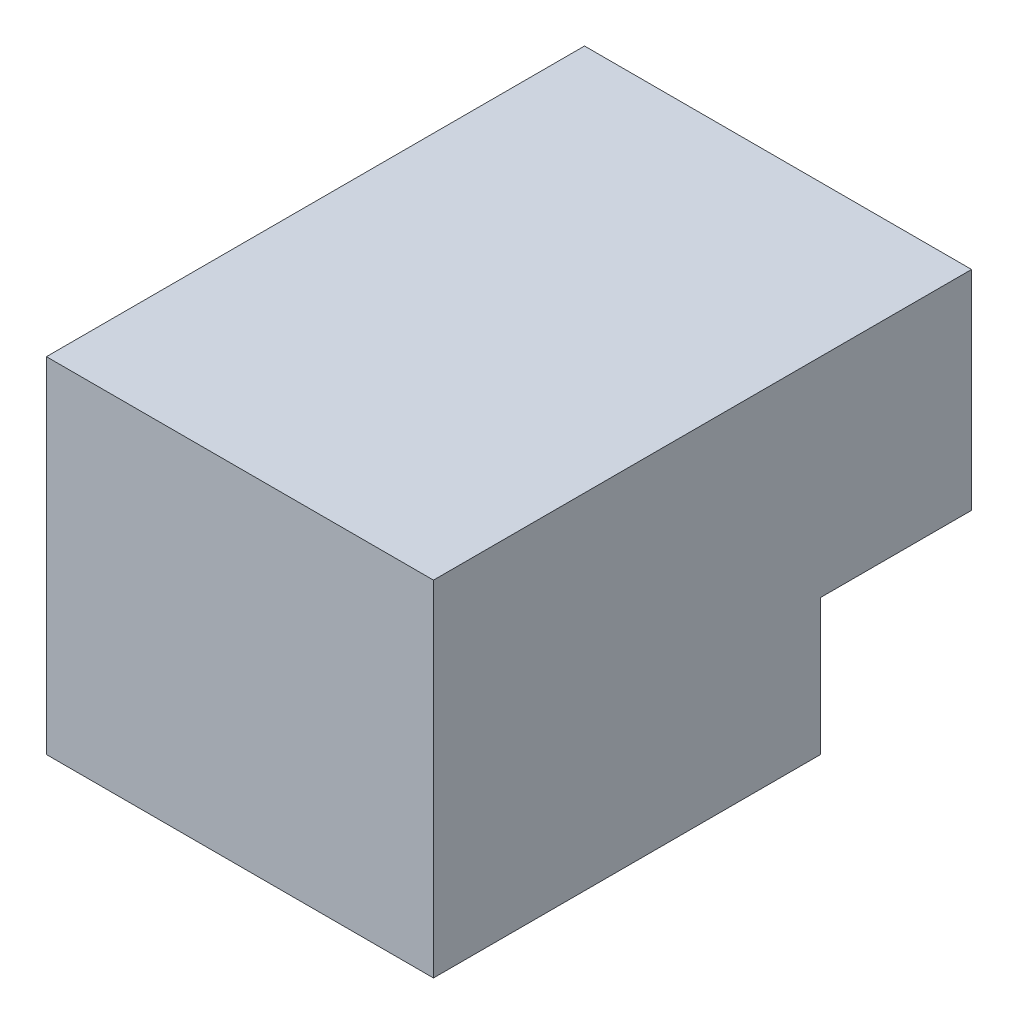
ISO-10303-21;
HEADER;
FILE_DESCRIPTION(('STEP AP214'),'2;1');
FILE_NAME('part.step','',(''),(''),'','','');
FILE_SCHEMA(('AUTOMOTIVE_DESIGN { 1 0 10303 214 1 1 1 1 }'));
ENDSEC;
DATA;
#1=APPLICATION_CONTEXT('core data for automotive mechanical design processes');
#2=APPLICATION_PROTOCOL_DEFINITION('international standard','automotive_design',2000,#1);
#3=PRODUCT_CONTEXT('',#1,'mechanical');
#4=PRODUCT('Part','Part','',(#3));
#5=PRODUCT_RELATED_PRODUCT_CATEGORY('part','',(#4));
#6=PRODUCT_DEFINITION_FORMATION('','',#4);
#7=PRODUCT_DEFINITION_CONTEXT('part definition',#1,'design');
#8=PRODUCT_DEFINITION('design','',#6,#7);
#9=PRODUCT_DEFINITION_SHAPE('','',#8);
#10=(LENGTH_UNIT() NAMED_UNIT(*) SI_UNIT(.MILLI.,.METRE.));
#11=(NAMED_UNIT(*) PLANE_ANGLE_UNIT() SI_UNIT($,.RADIAN.));
#12=(NAMED_UNIT(*) SI_UNIT($,.STERADIAN.) SOLID_ANGLE_UNIT());
#13=UNCERTAINTY_MEASURE_WITH_UNIT(LENGTH_MEASURE(1.E-05),#10,'distance_accuracy_value','');
#14=(GEOMETRIC_REPRESENTATION_CONTEXT(3) GLOBAL_UNCERTAINTY_ASSIGNED_CONTEXT((#13)) GLOBAL_UNIT_ASSIGNED_CONTEXT((#10,
#11,#12)) REPRESENTATION_CONTEXT('',''));
#15=CARTESIAN_POINT('',(0.,0.,0.));
#16=DIRECTION('',(0.,0.,1.));
#17=DIRECTION('',(1.,0.,0.));
#18=AXIS2_PLACEMENT_3D('',#15,#16,#17);
#19=CARTESIAN_POINT('',(-2.54,25.4,-62.54));
#20=DIRECTION('',(0.,0.,1.));
#21=DIRECTION('',(1.,0.,0.));
#22=AXIS2_PLACEMENT_3D('',#19,#20,#21);
#23=PLANE('',#22);
#24=DIRECTION('',(-1.,0.,0.));
#25=VECTOR('',#24,1.);
#26=CARTESIAN_POINT('',(62.54,22.86,-62.54));
#27=LINE('',#26,#25);
#28=CARTESIAN_POINT('',(62.54,22.86,-62.54));
#29=VERTEX_POINT('',#28);
#30=CARTESIAN_POINT('',(-2.54,22.86,-62.54));
#31=VERTEX_POINT('',#30);
#32=EDGE_CURVE('E152',#29,#31,#27,.T.);
#33=ORIENTED_EDGE('',*,*,#32,.F.);
#34=DIRECTION('',(0.,-1.,0.));
#35=VECTOR('',#34,1.);
#36=CARTESIAN_POINT('',(62.54,25.4,-62.54));
#37=LINE('',#36,#35);
#38=CARTESIAN_POINT('',(62.54,0.,-62.54));
#39=VERTEX_POINT('',#38);
#40=EDGE_CURVE('E48',#29,#39,#37,.T.);
#41=ORIENTED_EDGE('',*,*,#40,.T.);
#42=DIRECTION('',(-1.,0.,0.));
#43=VECTOR('',#42,1.);
#44=CARTESIAN_POINT('',(-2.54,0.,-62.54));
#45=LINE('',#44,#43);
#46=CARTESIAN_POINT('',(-2.54,0.,-62.54));
#47=VERTEX_POINT('',#46);
#48=EDGE_CURVE('E241',#39,#47,#45,.T.);
#49=ORIENTED_EDGE('',*,*,#48,.T.);
#50=DIRECTION('',(0.,-1.,0.));
#51=VECTOR('',#50,1.);
#52=CARTESIAN_POINT('',(-2.54,25.4,-62.54));
#53=LINE('',#52,#51);
#54=EDGE_CURVE('E252',#31,#47,#53,.T.);
#55=ORIENTED_EDGE('',*,*,#54,.F.);
#56=EDGE_LOOP('',(#33,#41,#49,#55));
#57=FACE_BOUND('',#56,.T.);
#58=ADVANCED_FACE('F39',(#57),#23,.F.);
#59=CARTESIAN_POINT('',(0.,25.4,0.));
#60=DIRECTION('',(0.,1.,0.));
#61=DIRECTION('',(0.,0.,1.));
#62=AXIS2_PLACEMENT_3D('',#59,#60,#61);
#63=PLANE('',#62);
#64=DIRECTION('',(0.,0.,-1.));
#65=VECTOR('',#64,1.);
#66=CARTESIAN_POINT('',(0.,25.4,75.3016519878432));
#67=LINE('',#66,#65);
#68=CARTESIAN_POINT('',(0.,25.4,-60.));
#69=VERTEX_POINT('',#68);
#70=CARTESIAN_POINT('',(0.,25.4,-87.94));
#71=VERTEX_POINT('',#70);
#72=EDGE_CURVE('E202',#69,#71,#67,.T.);
#73=ORIENTED_EDGE('',*,*,#72,.F.);
#74=DIRECTION('',(-1.,0.,0.));
#75=VECTOR('',#74,1.);
#76=CARTESIAN_POINT('',(0.,25.4,-60.));
#77=LINE('',#76,#75);
#78=CARTESIAN_POINT('',(60.,25.4,-60.));
#79=VERTEX_POINT('',#78);
#80=EDGE_CURVE('E209',#79,#69,#77,.T.);
#81=ORIENTED_EDGE('',*,*,#80,.F.);
#82=DIRECTION('',(0.,0.,-1.));
#83=VECTOR('',#82,1.);
#84=CARTESIAN_POINT('',(60.,25.4,75.3016519878432));
#85=LINE('',#84,#83);
#86=CARTESIAN_POINT('',(60.,25.4,-87.94));
#87=VERTEX_POINT('',#86);
#88=EDGE_CURVE('E63',#79,#87,#85,.T.);
#89=ORIENTED_EDGE('',*,*,#88,.T.);
#90=DIRECTION('',(1.,0.,0.));
#91=VECTOR('',#90,1.);
#92=CARTESIAN_POINT('',(62.54,25.4,-87.94));
#93=LINE('',#92,#91);
#94=EDGE_CURVE('E161',#71,#87,#93,.T.);
#95=ORIENTED_EDGE('',*,*,#94,.F.);
#96=EDGE_LOOP('',(#73,#81,#89,#95));
#97=FACE_BOUND('',#96,.T.);
#98=ADVANCED_FACE('F292',(#97),#63,.T.);
#99=CARTESIAN_POINT('',(0.,0.,0.));
#100=DIRECTION('',(0.,1.,0.));
#101=DIRECTION('',(0.,0.,1.));
#102=AXIS2_PLACEMENT_3D('',#99,#100,#101);
#103=PLANE('',#102);
#104=DIRECTION('',(1.,0.,0.));
#105=VECTOR('',#104,1.);
#106=CARTESIAN_POINT('',(-2.54,0.,2.54));
#107=LINE('',#106,#105);
#108=CARTESIAN_POINT('',(-2.54,0.,2.54));
#109=VERTEX_POINT('',#108);
#110=CARTESIAN_POINT('',(62.54,0.,2.54));
#111=VERTEX_POINT('',#110);
#112=EDGE_CURVE('E233',#109,#111,#107,.T.);
#113=ORIENTED_EDGE('',*,*,#112,.F.);
#114=DIRECTION('',(0.,0.,1.));
#115=VECTOR('',#114,1.);
#116=CARTESIAN_POINT('',(-2.54,0.,2.54));
#117=LINE('',#116,#115);
#118=EDGE_CURVE('E245',#47,#109,#117,.T.);
#119=ORIENTED_EDGE('',*,*,#118,.F.);
#120=ORIENTED_EDGE('',*,*,#48,.F.);
#121=DIRECTION('',(0.,0.,-1.));
#122=VECTOR('',#121,1.);
#123=CARTESIAN_POINT('',(62.54,0.,2.54));
#124=LINE('',#123,#122);
#125=EDGE_CURVE('E237',#111,#39,#124,.T.);
#126=ORIENTED_EDGE('',*,*,#125,.F.);
#127=EDGE_LOOP('',(#113,#119,#120,#126));
#128=FACE_BOUND('',#127,.T.);
#129=DIRECTION('',(0.,0.,1.));
#130=VECTOR('',#129,1.);
#131=CARTESIAN_POINT('',(0.,0.,0.));
#132=LINE('',#131,#130);
#133=CARTESIAN_POINT('',(0.,0.,-60.));
#134=VERTEX_POINT('',#133);
#135=CARTESIAN_POINT('',(0.,0.,0.));
#136=VERTEX_POINT('',#135);
#137=EDGE_CURVE('E195',#134,#136,#132,.T.);
#138=ORIENTED_EDGE('',*,*,#137,.T.);
#139=DIRECTION('',(1.,0.,0.));
#140=VECTOR('',#139,1.);
#141=CARTESIAN_POINT('',(0.,0.,0.));
#142=LINE('',#141,#140);
#143=CARTESIAN_POINT('',(60.,0.,0.));
#144=VERTEX_POINT('',#143);
#145=EDGE_CURVE('E218',#136,#144,#142,.T.);
#146=ORIENTED_EDGE('',*,*,#145,.T.);
#147=DIRECTION('',(0.,0.,-1.));
#148=VECTOR('',#147,1.);
#149=CARTESIAN_POINT('',(60.,0.,0.));
#150=LINE('',#149,#148);
#151=CARTESIAN_POINT('',(60.,0.,-60.));
#152=VERTEX_POINT('',#151);
#153=EDGE_CURVE('E135',#144,#152,#150,.T.);
#154=ORIENTED_EDGE('',*,*,#153,.T.);
#155=DIRECTION('',(-1.,0.,0.));
#156=VECTOR('',#155,1.);
#157=CARTESIAN_POINT('',(0.,0.,-60.));
#158=LINE('',#157,#156);
#159=EDGE_CURVE('E214',#152,#134,#158,.T.);
#160=ORIENTED_EDGE('',*,*,#159,.T.);
#161=EDGE_LOOP('',(#138,#146,#154,#160));
#162=FACE_BOUND('',#161,.T.);
#163=ADVANCED_FACE('F267',(#128,#162),#103,.F.);
#164=CARTESIAN_POINT('',(-2.54,25.4,2.54));
#165=DIRECTION('',(0.,0.,-1.));
#166=DIRECTION('',(-1.,0.,0.));
#167=AXIS2_PLACEMENT_3D('',#164,#165,#166);
#168=PLANE('',#167);
#169=DIRECTION('',(0.,-1.,0.));
#170=VECTOR('',#169,1.);
#171=CARTESIAN_POINT('',(62.54,25.4,2.54));
#172=LINE('',#171,#170);
#173=CARTESIAN_POINT('',(62.54,57.94,2.54));
#174=VERTEX_POINT('',#173);
#175=EDGE_CURVE('E11',#174,#111,#172,.T.);
#176=ORIENTED_EDGE('',*,*,#175,.F.);
#177=DIRECTION('',(-1.,0.,0.));
#178=VECTOR('',#177,1.);
#179=CARTESIAN_POINT('',(62.54,57.94,2.54));
#180=LINE('',#179,#178);
#181=CARTESIAN_POINT('',(-2.54,57.94,2.54));
#182=VERTEX_POINT('',#181);
#183=EDGE_CURVE('E191',#174,#182,#180,.T.);
#184=ORIENTED_EDGE('',*,*,#183,.T.);
#185=DIRECTION('',(0.,-1.,0.));
#186=VECTOR('',#185,1.);
#187=CARTESIAN_POINT('',(-2.54,25.4,2.54));
#188=LINE('',#187,#186);
#189=EDGE_CURVE('E248',#182,#109,#188,.T.);
#190=ORIENTED_EDGE('',*,*,#189,.T.);
#191=ORIENTED_EDGE('',*,*,#112,.T.);
#192=EDGE_LOOP('',(#176,#184,#190,#191));
#193=FACE_BOUND('',#192,.T.);
#194=ADVANCED_FACE('F41',(#193),#168,.F.);
#195=CARTESIAN_POINT('',(62.54,25.4,2.54));
#196=DIRECTION('',(-1.,0.,0.));
#197=DIRECTION('',(0.,0.,1.));
#198=AXIS2_PLACEMENT_3D('',#195,#196,#197);
#199=PLANE('',#198);
#200=ORIENTED_EDGE('',*,*,#40,.F.);
#201=DIRECTION('',(0.,0.,1.));
#202=VECTOR('',#201,1.);
#203=CARTESIAN_POINT('',(62.54,22.86,-87.94));
#204=LINE('',#203,#202);
#205=CARTESIAN_POINT('',(62.54,22.86,-87.94));
#206=VERTEX_POINT('',#205);
#207=EDGE_CURVE('E168',#206,#29,#204,.T.);
#208=ORIENTED_EDGE('',*,*,#207,.F.);
#209=DIRECTION('',(0.,-1.,0.));
#210=VECTOR('',#209,1.);
#211=CARTESIAN_POINT('',(62.54,25.4,-87.94));
#212=LINE('',#211,#210);
#213=CARTESIAN_POINT('',(62.54,57.94,-87.94));
#214=VERTEX_POINT('',#213);
#215=EDGE_CURVE('E188',#214,#206,#212,.T.);
#216=ORIENTED_EDGE('',*,*,#215,.F.);
#217=DIRECTION('',(0.,0.,-1.));
#218=VECTOR('',#217,1.);
#219=CARTESIAN_POINT('',(62.54,57.94,75.3016519878432));
#220=LINE('',#219,#218);
#221=EDGE_CURVE('E196',#174,#214,#220,.T.);
#222=ORIENTED_EDGE('',*,*,#221,.F.);
#223=ORIENTED_EDGE('',*,*,#175,.T.);
#224=ORIENTED_EDGE('',*,*,#125,.T.);
#225=EDGE_LOOP('',(#200,#208,#216,#222,#223,#224));
#226=FACE_BOUND('',#225,.T.);
#227=ADVANCED_FACE('F263',(#226),#199,.F.);
#228=CARTESIAN_POINT('',(-2.54,25.4,2.54));
#229=DIRECTION('',(1.,0.,0.));
#230=DIRECTION('',(0.,0.,-1.));
#231=AXIS2_PLACEMENT_3D('',#228,#229,#230);
#232=PLANE('',#231);
#233=DIRECTION('',(0.,0.,1.));
#234=VECTOR('',#233,1.);
#235=CARTESIAN_POINT('',(-2.54,22.86,-87.94));
#236=LINE('',#235,#234);
#237=CARTESIAN_POINT('',(-2.54,22.86,-87.94));
#238=VERTEX_POINT('',#237);
#239=EDGE_CURVE('E163',#238,#31,#236,.T.);
#240=ORIENTED_EDGE('',*,*,#239,.T.);
#241=ORIENTED_EDGE('',*,*,#54,.T.);
#242=ORIENTED_EDGE('',*,*,#118,.T.);
#243=ORIENTED_EDGE('',*,*,#189,.F.);
#244=DIRECTION('',(0.,0.,-1.));
#245=VECTOR('',#244,1.);
#246=CARTESIAN_POINT('',(-2.54,57.94,75.3016519878432));
#247=LINE('',#246,#245);
#248=CARTESIAN_POINT('',(-2.54,57.94,-87.94));
#249=VERTEX_POINT('',#248);
#250=EDGE_CURVE('E199',#182,#249,#247,.T.);
#251=ORIENTED_EDGE('',*,*,#250,.T.);
#252=DIRECTION('',(0.,1.,0.));
#253=VECTOR('',#252,1.);
#254=CARTESIAN_POINT('',(-2.54,57.94,-87.94));
#255=LINE('',#254,#253);
#256=EDGE_CURVE('E180',#238,#249,#255,.T.);
#257=ORIENTED_EDGE('',*,*,#256,.F.);
#258=EDGE_LOOP('',(#240,#241,#242,#243,#251,#257));
#259=FACE_BOUND('',#258,.T.);
#260=ADVANCED_FACE('F270',(#259),#232,.F.);
#261=CARTESIAN_POINT('',(0.,25.4,0.));
#262=DIRECTION('',(1.,0.,0.));
#263=DIRECTION('',(0.,0.,-1.));
#264=AXIS2_PLACEMENT_3D('',#261,#262,#263);
#265=PLANE('',#264);
#266=DIRECTION('',(0.,0.,-1.));
#267=VECTOR('',#266,1.);
#268=CARTESIAN_POINT('',(0.,55.4,75.3016519878432));
#269=LINE('',#268,#267);
#270=CARTESIAN_POINT('',(0.,55.4,0.));
#271=VERTEX_POINT('',#270);
#272=CARTESIAN_POINT('',(0.,55.4,-87.94));
#273=VERTEX_POINT('',#272);
#274=EDGE_CURVE('E148',#271,#273,#269,.T.);
#275=ORIENTED_EDGE('',*,*,#274,.F.);
#276=DIRECTION('',(0.,-1.,0.));
#277=VECTOR('',#276,1.);
#278=CARTESIAN_POINT('',(0.,25.4,0.));
#279=LINE('',#278,#277);
#280=EDGE_CURVE('E55',#271,#136,#279,.T.);
#281=ORIENTED_EDGE('',*,*,#280,.T.);
#282=ORIENTED_EDGE('',*,*,#137,.F.);
#283=DIRECTION('',(0.,-1.,0.));
#284=VECTOR('',#283,1.);
#285=CARTESIAN_POINT('',(0.,25.4,-60.));
#286=LINE('',#285,#284);
#287=EDGE_CURVE('E213',#69,#134,#286,.T.);
#288=ORIENTED_EDGE('',*,*,#287,.F.);
#289=ORIENTED_EDGE('',*,*,#72,.T.);
#290=DIRECTION('',(0.,-1.,0.));
#291=VECTOR('',#290,1.);
#292=CARTESIAN_POINT('',(0.,25.4,-87.94));
#293=LINE('',#292,#291);
#294=EDGE_CURVE('E176',#273,#71,#293,.T.);
#295=ORIENTED_EDGE('',*,*,#294,.F.);
#296=EDGE_LOOP('',(#275,#281,#282,#288,#289,#295));
#297=FACE_BOUND('',#296,.T.);
#298=ADVANCED_FACE('F306',(#297),#265,.T.);
#299=CARTESIAN_POINT('',(0.,25.4,0.));
#300=DIRECTION('',(0.,0.,-1.));
#301=DIRECTION('',(-1.,0.,0.));
#302=AXIS2_PLACEMENT_3D('',#299,#300,#301);
#303=PLANE('',#302);
#304=ORIENTED_EDGE('',*,*,#145,.F.);
#305=ORIENTED_EDGE('',*,*,#280,.F.);
#306=DIRECTION('',(-1.,0.,0.));
#307=VECTOR('',#306,1.);
#308=CARTESIAN_POINT('',(0.,55.4,0.));
#309=LINE('',#308,#307);
#310=CARTESIAN_POINT('',(60.,55.4,0.));
#311=VERTEX_POINT('',#310);
#312=EDGE_CURVE('E143',#311,#271,#309,.T.);
#313=ORIENTED_EDGE('',*,*,#312,.F.);
#314=DIRECTION('',(0.,-1.,0.));
#315=VECTOR('',#314,1.);
#316=CARTESIAN_POINT('',(60.,25.4,0.));
#317=LINE('',#316,#315);
#318=EDGE_CURVE('E129',#311,#144,#317,.T.);
#319=ORIENTED_EDGE('',*,*,#318,.T.);
#320=EDGE_LOOP('',(#304,#305,#313,#319));
#321=FACE_BOUND('',#320,.T.);
#322=ADVANCED_FACE('F150',(#321),#303,.T.);
#323=CARTESIAN_POINT('',(60.,25.4,0.));
#324=DIRECTION('',(-1.,0.,0.));
#325=DIRECTION('',(0.,0.,1.));
#326=AXIS2_PLACEMENT_3D('',#323,#324,#325);
#327=PLANE('',#326);
#328=ORIENTED_EDGE('',*,*,#318,.F.);
#329=DIRECTION('',(0.,0.,-1.));
#330=VECTOR('',#329,1.);
#331=CARTESIAN_POINT('',(60.,55.4,75.3016519878432));
#332=LINE('',#331,#330);
#333=CARTESIAN_POINT('',(60.,55.4,-87.94));
#334=VERTEX_POINT('',#333);
#335=EDGE_CURVE('E132',#311,#334,#332,.T.);
#336=ORIENTED_EDGE('',*,*,#335,.T.);
#337=DIRECTION('',(0.,1.,0.));
#338=VECTOR('',#337,1.);
#339=CARTESIAN_POINT('',(60.,55.4,-87.94));
#340=LINE('',#339,#338);
#341=EDGE_CURVE('E171',#87,#334,#340,.T.);
#342=ORIENTED_EDGE('',*,*,#341,.F.);
#343=ORIENTED_EDGE('',*,*,#88,.F.);
#344=DIRECTION('',(0.,-1.,0.));
#345=VECTOR('',#344,1.);
#346=CARTESIAN_POINT('',(60.,25.4,-60.));
#347=LINE('',#346,#345);
#348=EDGE_CURVE('E138',#79,#152,#347,.T.);
#349=ORIENTED_EDGE('',*,*,#348,.T.);
#350=ORIENTED_EDGE('',*,*,#153,.F.);
#351=EDGE_LOOP('',(#328,#336,#342,#343,#349,#350));
#352=FACE_BOUND('',#351,.T.);
#353=ADVANCED_FACE('F131',(#352),#327,.T.);
#354=CARTESIAN_POINT('',(0.,25.4,-60.));
#355=DIRECTION('',(0.,0.,1.));
#356=DIRECTION('',(1.,0.,0.));
#357=AXIS2_PLACEMENT_3D('',#354,#355,#356);
#358=PLANE('',#357);
#359=ORIENTED_EDGE('',*,*,#159,.F.);
#360=ORIENTED_EDGE('',*,*,#348,.F.);
#361=ORIENTED_EDGE('',*,*,#80,.T.);
#362=ORIENTED_EDGE('',*,*,#287,.T.);
#363=EDGE_LOOP('',(#359,#360,#361,#362));
#364=FACE_BOUND('',#363,.T.);
#365=ADVANCED_FACE('F320',(#364),#358,.T.);
#366=CARTESIAN_POINT('',(62.54,57.94,75.3016519878432));
#367=DIRECTION('',(0.,1.,0.));
#368=DIRECTION('',(0.,0.,1.));
#369=AXIS2_PLACEMENT_3D('',#366,#367,#368);
#370=PLANE('',#369);
#371=ORIENTED_EDGE('',*,*,#183,.F.);
#372=ORIENTED_EDGE('',*,*,#221,.T.);
#373=DIRECTION('',(1.,0.,0.));
#374=VECTOR('',#373,1.);
#375=CARTESIAN_POINT('',(62.54,57.94,-87.94));
#376=LINE('',#375,#374);
#377=EDGE_CURVE('E184',#249,#214,#376,.T.);
#378=ORIENTED_EDGE('',*,*,#377,.F.);
#379=ORIENTED_EDGE('',*,*,#250,.F.);
#380=EDGE_LOOP('',(#371,#372,#378,#379));
#381=FACE_BOUND('',#380,.T.);
#382=ADVANCED_FACE('F276',(#381),#370,.T.);
#383=CARTESIAN_POINT('',(0.,55.4,75.3016519878432));
#384=DIRECTION('',(0.,-1.,0.));
#385=DIRECTION('',(0.,0.,-1.));
#386=AXIS2_PLACEMENT_3D('',#383,#384,#385);
#387=PLANE('',#386);
#388=ORIENTED_EDGE('',*,*,#312,.T.);
#389=ORIENTED_EDGE('',*,*,#274,.T.);
#390=DIRECTION('',(-1.,0.,0.));
#391=VECTOR('',#390,1.);
#392=CARTESIAN_POINT('',(0.,55.4,-87.94));
#393=LINE('',#392,#391);
#394=EDGE_CURVE('E146',#334,#273,#393,.T.);
#395=ORIENTED_EDGE('',*,*,#394,.F.);
#396=ORIENTED_EDGE('',*,*,#335,.F.);
#397=EDGE_LOOP('',(#388,#389,#395,#396));
#398=FACE_BOUND('',#397,.T.);
#399=ADVANCED_FACE('F142',(#398),#387,.T.);
#400=CARTESIAN_POINT('',(0.,0.,-87.94));
#401=DIRECTION('',(0.,0.,1.));
#402=DIRECTION('',(1.,0.,0.));
#403=AXIS2_PLACEMENT_3D('',#400,#401,#402);
#404=PLANE('',#403);
#405=DIRECTION('',(-1.,0.,0.));
#406=VECTOR('',#405,1.);
#407=CARTESIAN_POINT('',(62.54,22.86,-87.94));
#408=LINE('',#407,#406);
#409=EDGE_CURVE('E155',#206,#238,#408,.T.);
#410=ORIENTED_EDGE('',*,*,#409,.T.);
#411=ORIENTED_EDGE('',*,*,#256,.T.);
#412=ORIENTED_EDGE('',*,*,#377,.T.);
#413=ORIENTED_EDGE('',*,*,#215,.T.);
#414=EDGE_LOOP('',(#410,#411,#412,#413));
#415=FACE_BOUND('',#414,.T.);
#416=ORIENTED_EDGE('',*,*,#294,.T.);
#417=ORIENTED_EDGE('',*,*,#94,.T.);
#418=ORIENTED_EDGE('',*,*,#341,.T.);
#419=ORIENTED_EDGE('',*,*,#394,.T.);
#420=EDGE_LOOP('',(#416,#417,#418,#419));
#421=FACE_BOUND('',#420,.T.);
#422=ADVANCED_FACE('F278',(#415,#421),#404,.F.);
#423=CARTESIAN_POINT('',(62.54,22.86,-87.94));
#424=DIRECTION('',(0.,1.,0.));
#425=DIRECTION('',(0.,0.,1.));
#426=AXIS2_PLACEMENT_3D('',#423,#424,#425);
#427=PLANE('',#426);
#428=ORIENTED_EDGE('',*,*,#32,.T.);
#429=ORIENTED_EDGE('',*,*,#239,.F.);
#430=ORIENTED_EDGE('',*,*,#409,.F.);
#431=ORIENTED_EDGE('',*,*,#207,.T.);
#432=EDGE_LOOP('',(#428,#429,#430,#431));
#433=FACE_BOUND('',#432,.T.);
#434=ADVANCED_FACE('F284',(#433),#427,.F.);
#435=CLOSED_SHELL('',(#58,#98,#163,#194,#227,#260,#298,#322,#353,#365,#382,#399,#422,#434));
#436=MANIFOLD_SOLID_BREP('B2',#435);
#437=ADVANCED_BREP_SHAPE_REPRESENTATION('',(#18,#436),#14);
#438=SHAPE_DEFINITION_REPRESENTATION(#9,#437);
ENDSEC;
END-ISO-10303-21;
